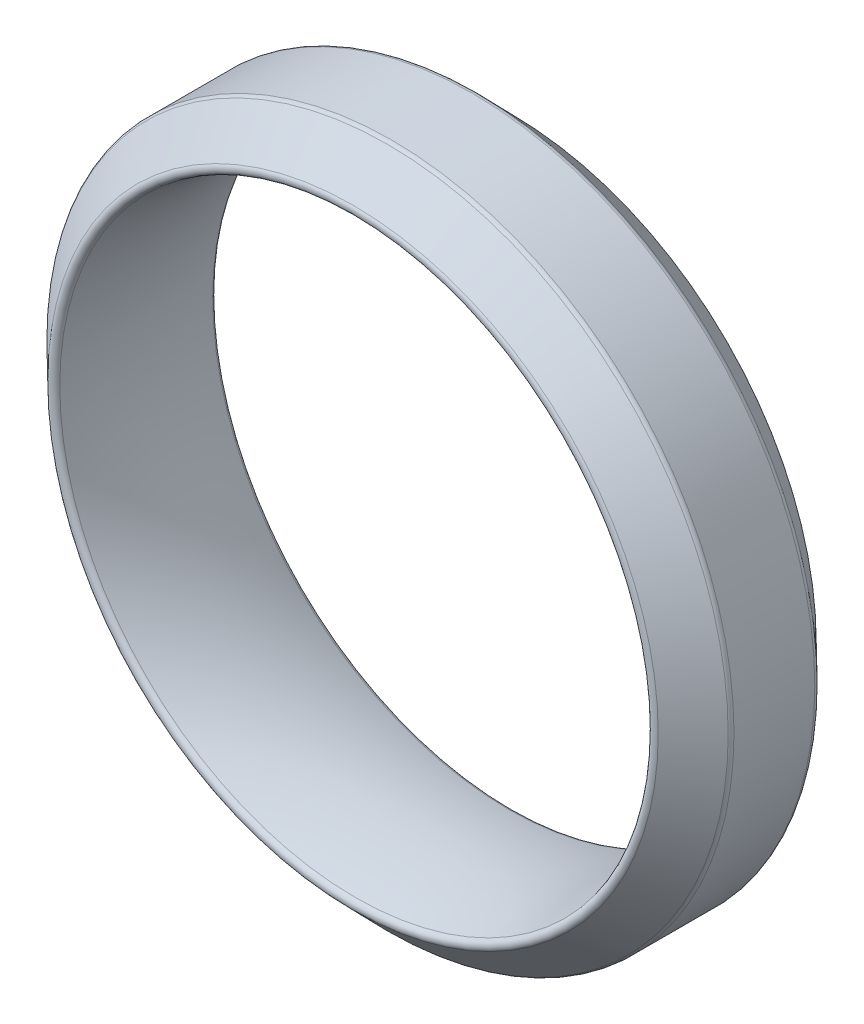
ISO-10303-21;
HEADER;
FILE_DESCRIPTION(('STEP AP214'),'2;1');
FILE_NAME('part.step','',(''),(''),'','','');
FILE_SCHEMA(('AUTOMOTIVE_DESIGN { 1 0 10303 214 1 1 1 1 }'));
ENDSEC;
DATA;
#1=APPLICATION_CONTEXT('core data for automotive mechanical design processes');
#2=APPLICATION_PROTOCOL_DEFINITION('international standard','automotive_design',2000,#1);
#3=PRODUCT_CONTEXT('',#1,'mechanical');
#4=PRODUCT('Part','Part','',(#3));
#5=PRODUCT_RELATED_PRODUCT_CATEGORY('part','',(#4));
#6=PRODUCT_DEFINITION_FORMATION('','',#4);
#7=PRODUCT_DEFINITION_CONTEXT('part definition',#1,'design');
#8=PRODUCT_DEFINITION('design','',#6,#7);
#9=PRODUCT_DEFINITION_SHAPE('','',#8);
#10=(LENGTH_UNIT() NAMED_UNIT(*) SI_UNIT(.MILLI.,.METRE.));
#11=(NAMED_UNIT(*) PLANE_ANGLE_UNIT() SI_UNIT($,.RADIAN.));
#12=(NAMED_UNIT(*) SI_UNIT($,.STERADIAN.) SOLID_ANGLE_UNIT());
#13=UNCERTAINTY_MEASURE_WITH_UNIT(LENGTH_MEASURE(1.E-05),#10,'distance_accuracy_value','');
#14=(GEOMETRIC_REPRESENTATION_CONTEXT(3) GLOBAL_UNCERTAINTY_ASSIGNED_CONTEXT((#13)) GLOBAL_UNIT_ASSIGNED_CONTEXT((#10,
#11,#12)) REPRESENTATION_CONTEXT('',''));
#15=CARTESIAN_POINT('',(0.,0.,0.));
#16=DIRECTION('',(0.,0.,1.));
#17=DIRECTION('',(1.,0.,0.));
#18=AXIS2_PLACEMENT_3D('',#15,#16,#17);
#19=CARTESIAN_POINT('',(0.,-12.7,0.));
#20=DIRECTION('',(0.,0.,1.));
#21=DIRECTION('',(1.,0.,0.));
#22=AXIS2_PLACEMENT_3D('',#19,#20,#21);
#23=TOROIDAL_SURFACE('',#22,25.4,12.7);
#24=CARTESIAN_POINT('',(0.,-12.7,-3.40255072801759));
#25=DIRECTION('',(0.,0.,1.));
#26=DIRECTION('',(1.,0.,0.));
#27=AXIS2_PLACEMENT_3D('',#24,#25,#26);
#28=CIRCLE('',#27,13.1642879838047);
#29=CARTESIAN_POINT('',(13.1642879838047,-12.7,-3.40255072801759));
#30=VERTEX_POINT('',#29);
#31=EDGE_CURVE('E60',#30,#30,#28,.F.);
#32=ORIENTED_EDGE('',*,*,#31,.T.);
#33=EDGE_LOOP('',(#32));
#34=FACE_BOUND('',#33,.T.);
#35=CARTESIAN_POINT('',(0.,-12.7,3.40255072801759));
#36=DIRECTION('',(0.,0.,-1.));
#37=DIRECTION('',(-1.,0.,0.));
#38=AXIS2_PLACEMENT_3D('',#35,#36,#37);
#39=CIRCLE('',#38,13.1642879838047);
#40=CARTESIAN_POINT('',(-13.1642879838047,-12.7,3.40255072801759));
#41=VERTEX_POINT('',#40);
#42=EDGE_CURVE('E63',#41,#41,#39,.F.);
#43=ORIENTED_EDGE('',*,*,#42,.T.);
#44=EDGE_LOOP('',(#43));
#45=FACE_BOUND('',#44,.T.);
#46=ADVANCED_FACE('F37',(#34,#45),#23,.T.);
#47=CARTESIAN_POINT('',(0.,-12.7,-3.81));
#48=DIRECTION('',(0.,0.,1.));
#49=DIRECTION('',(1.,0.,0.));
#50=AXIS2_PLACEMENT_3D('',#47,#48,#49);
#51=CONICAL_SURFACE('',#50,13.2849721420048,0.798357929229645);
#52=CARTESIAN_POINT('',(0.,-12.7,-1.9797738730655));
#53=DIRECTION('',(0.,0.,-1.));
#54=DIRECTION('',(-1.,0.,0.));
#55=AXIS2_PLACEMENT_3D('',#52,#53,#54);
#56=CIRCLE('',#55,15.163262464623);
#57=CARTESIAN_POINT('',(-15.163262464623,-12.7,-1.9797738730655));
#58=VERTEX_POINT('',#57);
#59=EDGE_CURVE('E44',#58,#58,#56,.T.);
#60=ORIENTED_EDGE('',*,*,#59,.T.);
#61=EDGE_LOOP('',(#60));
#62=FACE_BOUND('',#61,.T.);
#63=CARTESIAN_POINT('',(0.,-12.7,-3.51641732842563));
#64=DIRECTION('',(0.,0.,-1.));
#65=DIRECTION('',(-1.,0.,0.));
#66=AXIS2_PLACEMENT_3D('',#63,#64,#65);
#67=CIRCLE('',#66,13.5862646887515);
#68=CARTESIAN_POINT('',(-13.5862646887515,-12.7,-3.51641732842563));
#69=VERTEX_POINT('',#68);
#70=EDGE_CURVE('E66',#69,#69,#67,.F.);
#71=ORIENTED_EDGE('',*,*,#70,.T.);
#72=EDGE_LOOP('',(#71));
#73=FACE_BOUND('',#72,.T.);
#74=ADVANCED_FACE('F70',(#62,#73),#51,.T.);
#75=CARTESIAN_POINT('',(0.,-12.7,24.8985158679634));
#76=DIRECTION('',(0.,0.,1.));
#77=DIRECTION('',(1.,0.,0.));
#78=AXIS2_PLACEMENT_3D('',#75,#76,#77);
#79=CYLINDRICAL_SURFACE('',#78,15.24);
#80=CARTESIAN_POINT('',(0.,-12.7,-1.7978562580971));
#81=DIRECTION('',(0.,0.,-1.));
#82=DIRECTION('',(-1.,0.,0.));
#83=AXIS2_PLACEMENT_3D('',#80,#81,#82);
#84=CIRCLE('',#83,15.24);
#85=CARTESIAN_POINT('',(-15.24,-12.7,-1.7978562580971));
#86=VERTEX_POINT('',#85);
#87=EDGE_CURVE('E48',#86,#86,#84,.F.);
#88=ORIENTED_EDGE('',*,*,#87,.T.);
#89=EDGE_LOOP('',(#88));
#90=FACE_BOUND('',#89,.T.);
#91=CARTESIAN_POINT('',(0.,-12.7,1.7978562580971));
#92=DIRECTION('',(0.,0.,-1.));
#93=DIRECTION('',(-1.,0.,0.));
#94=AXIS2_PLACEMENT_3D('',#91,#92,#93);
#95=CIRCLE('',#94,15.24);
#96=CARTESIAN_POINT('',(-15.24,-12.7,1.7978562580971));
#97=VERTEX_POINT('',#96);
#98=EDGE_CURVE('E52',#97,#97,#95,.T.);
#99=ORIENTED_EDGE('',*,*,#98,.T.);
#100=EDGE_LOOP('',(#99));
#101=FACE_BOUND('',#100,.T.);
#102=ADVANCED_FACE('F85',(#90,#101),#79,.T.);
#103=CARTESIAN_POINT('',(0.,-12.7,1.905));
#104=DIRECTION('',(0.,0.,-1.));
#105=DIRECTION('',(-1.,0.,0.));
#106=AXIS2_PLACEMENT_3D('',#103,#104,#105);
#107=CONICAL_SURFACE('',#106,15.24,0.798357929229645);
#108=CARTESIAN_POINT('',(0.,-12.7,1.9797738730655));
#109=DIRECTION('',(0.,0.,1.));
#110=DIRECTION('',(1.,0.,0.));
#111=AXIS2_PLACEMENT_3D('',#108,#109,#110);
#112=CIRCLE('',#111,15.163262464623);
#113=CARTESIAN_POINT('',(15.163262464623,-12.7,1.9797738730655));
#114=VERTEX_POINT('',#113);
#115=EDGE_CURVE('E10',#114,#114,#112,.T.);
#116=ORIENTED_EDGE('',*,*,#115,.T.);
#117=EDGE_LOOP('',(#116));
#118=FACE_BOUND('',#117,.T.);
#119=CARTESIAN_POINT('',(0.,-12.7,3.51641732842563));
#120=DIRECTION('',(0.,0.,1.));
#121=DIRECTION('',(1.,0.,0.));
#122=AXIS2_PLACEMENT_3D('',#119,#120,#121);
#123=CIRCLE('',#122,13.5862646887515);
#124=CARTESIAN_POINT('',(13.5862646887515,-12.7,3.51641732842563));
#125=VERTEX_POINT('',#124);
#126=EDGE_CURVE('E57',#125,#125,#123,.F.);
#127=ORIENTED_EDGE('',*,*,#126,.T.);
#128=EDGE_LOOP('',(#127));
#129=FACE_BOUND('',#128,.T.);
#130=ADVANCED_FACE('F75',(#118,#129),#107,.T.);
#131=CARTESIAN_POINT('',(0.,-12.7,-3.33449971345723));
#132=DIRECTION('',(0.,0.,-1.));
#133=DIRECTION('',(-1.,0.,0.));
#134=AXIS2_PLACEMENT_3D('',#131,#132,#133);
#135=TOROIDAL_SURFACE('',#134,13.4090022241286,0.254);
#136=ORIENTED_EDGE('',*,*,#31,.F.);
#137=EDGE_LOOP('',(#136));
#138=FACE_BOUND('',#137,.T.);
#139=ORIENTED_EDGE('',*,*,#70,.F.);
#140=EDGE_LOOP('',(#139));
#141=FACE_BOUND('',#140,.T.);
#142=ADVANCED_FACE('F72',(#138,#141),#135,.T.);
#143=CARTESIAN_POINT('',(0.,-12.7,3.33449971345723));
#144=DIRECTION('',(0.,0.,-1.));
#145=DIRECTION('',(-1.,0.,0.));
#146=AXIS2_PLACEMENT_3D('',#143,#144,#145);
#147=TOROIDAL_SURFACE('',#146,13.4090022241286,0.254);
#148=ORIENTED_EDGE('',*,*,#126,.F.);
#149=EDGE_LOOP('',(#148));
#150=FACE_BOUND('',#149,.T.);
#151=ORIENTED_EDGE('',*,*,#42,.F.);
#152=EDGE_LOOP('',(#151));
#153=FACE_BOUND('',#152,.T.);
#154=ADVANCED_FACE('F74',(#150,#153),#147,.T.);
#155=CARTESIAN_POINT('',(0.,-12.7,-1.7978562580971));
#156=DIRECTION('',(0.,0.,-1.));
#157=DIRECTION('',(-1.,0.,0.));
#158=AXIS2_PLACEMENT_3D('',#155,#156,#157);
#159=TOROIDAL_SURFACE('',#158,14.986,0.254);
#160=ORIENTED_EDGE('',*,*,#59,.F.);
#161=EDGE_LOOP('',(#160));
#162=FACE_BOUND('',#161,.T.);
#163=ORIENTED_EDGE('',*,*,#87,.F.);
#164=EDGE_LOOP('',(#163));
#165=FACE_BOUND('',#164,.T.);
#166=ADVANCED_FACE('F82',(#162,#165),#159,.T.);
#167=CARTESIAN_POINT('',(0.,-12.7,1.7978562580971));
#168=DIRECTION('',(0.,0.,-1.));
#169=DIRECTION('',(-1.,0.,0.));
#170=AXIS2_PLACEMENT_3D('',#167,#168,#169);
#171=TOROIDAL_SURFACE('',#170,14.986,0.254);
#172=ORIENTED_EDGE('',*,*,#98,.F.);
#173=EDGE_LOOP('',(#172));
#174=FACE_BOUND('',#173,.T.);
#175=ORIENTED_EDGE('',*,*,#115,.F.);
#176=EDGE_LOOP('',(#175));
#177=FACE_BOUND('',#176,.T.);
#178=ADVANCED_FACE('F39',(#174,#177),#171,.T.);
#179=CLOSED_SHELL('',(#46,#74,#102,#130,#142,#154,#166,#178));
#180=MANIFOLD_SOLID_BREP('B2',#179);
#181=ADVANCED_BREP_SHAPE_REPRESENTATION('',(#18,#180),#14);
#182=SHAPE_DEFINITION_REPRESENTATION(#9,#181);
ENDSEC;
END-ISO-10303-21;
